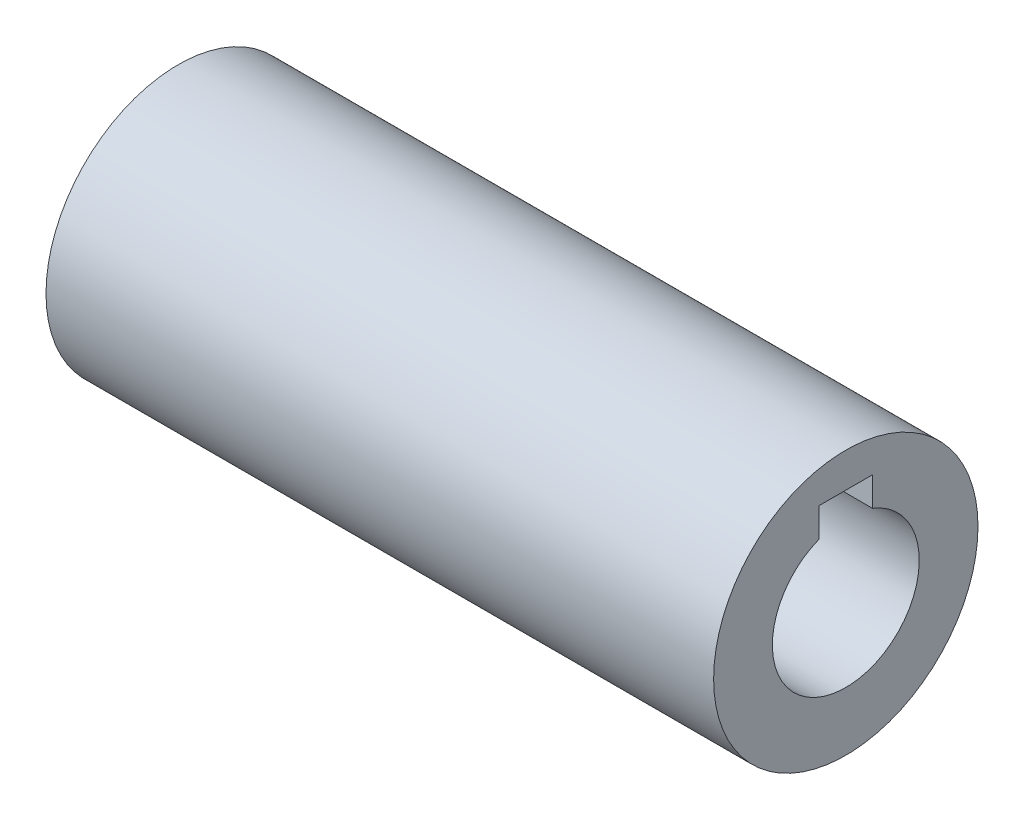
ISO-10303-21;
HEADER;
FILE_DESCRIPTION(('STEP AP214'),'2;1');
FILE_NAME('part.step','',(''),(''),'','','');
FILE_SCHEMA(('AUTOMOTIVE_DESIGN { 1 0 10303 214 1 1 1 1 }'));
ENDSEC;
DATA;
#1=APPLICATION_CONTEXT('core data for automotive mechanical design processes');
#2=APPLICATION_PROTOCOL_DEFINITION('international standard','automotive_design',2000,#1);
#3=PRODUCT_CONTEXT('',#1,'mechanical');
#4=PRODUCT('Part','Part','',(#3));
#5=PRODUCT_RELATED_PRODUCT_CATEGORY('part','',(#4));
#6=PRODUCT_DEFINITION_FORMATION('','',#4);
#7=PRODUCT_DEFINITION_CONTEXT('part definition',#1,'design');
#8=PRODUCT_DEFINITION('design','',#6,#7);
#9=PRODUCT_DEFINITION_SHAPE('','',#8);
#10=(LENGTH_UNIT() NAMED_UNIT(*) SI_UNIT(.MILLI.,.METRE.));
#11=(NAMED_UNIT(*) PLANE_ANGLE_UNIT() SI_UNIT($,.RADIAN.));
#12=(NAMED_UNIT(*) SI_UNIT($,.STERADIAN.) SOLID_ANGLE_UNIT());
#13=UNCERTAINTY_MEASURE_WITH_UNIT(LENGTH_MEASURE(1.E-05),#10,'distance_accuracy_value','');
#14=(GEOMETRIC_REPRESENTATION_CONTEXT(3) GLOBAL_UNCERTAINTY_ASSIGNED_CONTEXT((#13)) GLOBAL_UNIT_ASSIGNED_CONTEXT((#10,
#11,#12)) REPRESENTATION_CONTEXT('',''));
#15=CARTESIAN_POINT('',(0.,0.,0.));
#16=DIRECTION('',(0.,0.,1.));
#17=DIRECTION('',(1.,0.,0.));
#18=AXIS2_PLACEMENT_3D('',#15,#16,#17);
#19=CARTESIAN_POINT('',(-25.,-10.1705071808222,9.9));
#20=DIRECTION('',(-1.,0.,0.));
#21=DIRECTION('',(0.,1.,0.));
#22=AXIS2_PLACEMENT_3D('',#19,#20,#21);
#23=PLANE('',#22);
#24=CARTESIAN_POINT('',(-25.,0.,0.));
#25=DIRECTION('',(-1.,0.,0.));
#26=DIRECTION('',(0.,0.,-1.));
#27=AXIS2_PLACEMENT_3D('',#24,#25,#26);
#28=CIRCLE('',#27,9.9);
#29=CARTESIAN_POINT('',(-25.,0.,-9.9));
#30=VERTEX_POINT('',#29);
#31=EDGE_CURVE('E100',#30,#30,#28,.F.);
#32=ORIENTED_EDGE('',*,*,#31,.F.);
#33=EDGE_LOOP('',(#32));
#34=FACE_BOUND('',#33,.T.);
#35=DIRECTION('',(0.,-1.,0.));
#36=VECTOR('',#35,1.);
#37=CARTESIAN_POINT('',(-25.,7.3,2.));
#38=LINE('',#37,#36);
#39=CARTESIAN_POINT('',(-25.,5.1234753829798,2.));
#40=VERTEX_POINT('',#39);
#41=CARTESIAN_POINT('',(-25.,7.3,2.));
#42=VERTEX_POINT('',#41);
#43=EDGE_CURVE('E83',#40,#42,#38,.F.);
#44=ORIENTED_EDGE('',*,*,#43,.F.);
#45=CARTESIAN_POINT('',(-25.,0.,0.));
#46=DIRECTION('',(1.,0.,0.));
#47=DIRECTION('',(0.,-0.999999999999995,-1.02900297435445E-07));
#48=AXIS2_PLACEMENT_3D('',#45,#46,#47);
#49=CIRCLE('',#48,5.5);
#50=CARTESIAN_POINT('',(-25.,5.1234753829798,-2.));
#51=VERTEX_POINT('',#50);
#52=EDGE_CURVE('E97',#40,#51,#49,.T.);
#53=ORIENTED_EDGE('',*,*,#52,.T.);
#54=DIRECTION('',(0.,1.,0.));
#55=VECTOR('',#54,1.);
#56=CARTESIAN_POINT('',(-25.,5.1234753829798,-2.));
#57=LINE('',#56,#55);
#58=CARTESIAN_POINT('',(-25.,7.3,-2.));
#59=VERTEX_POINT('',#58);
#60=EDGE_CURVE('E105',#59,#51,#57,.F.);
#61=ORIENTED_EDGE('',*,*,#60,.F.);
#62=DIRECTION('',(0.,0.,1.));
#63=VECTOR('',#62,1.);
#64=CARTESIAN_POINT('',(-25.,7.3,-2.));
#65=LINE('',#64,#63);
#66=EDGE_CURVE('E99',#42,#59,#65,.F.);
#67=ORIENTED_EDGE('',*,*,#66,.F.);
#68=EDGE_LOOP('',(#44,#53,#61,#67));
#69=FACE_BOUND('',#68,.T.);
#70=ADVANCED_FACE('F16',(#34,#69),#23,.T.);
#71=CARTESIAN_POINT('',(25.,-10.1705071808222,-9.9));
#72=DIRECTION('',(1.,0.,0.));
#73=DIRECTION('',(0.,1.,0.));
#74=AXIS2_PLACEMENT_3D('',#71,#72,#73);
#75=PLANE('',#74);
#76=CARTESIAN_POINT('',(25.,0.,0.));
#77=DIRECTION('',(1.,0.,0.));
#78=DIRECTION('',(0.,0.,1.));
#79=AXIS2_PLACEMENT_3D('',#76,#77,#78);
#80=CIRCLE('',#79,9.9);
#81=CARTESIAN_POINT('',(25.,0.,9.9));
#82=VERTEX_POINT('',#81);
#83=EDGE_CURVE('E116',#82,#82,#80,.T.);
#84=ORIENTED_EDGE('',*,*,#83,.T.);
#85=EDGE_LOOP('',(#84));
#86=FACE_BOUND('',#85,.T.);
#87=DIRECTION('',(0.,0.,-1.));
#88=VECTOR('',#87,1.);
#89=CARTESIAN_POINT('',(25.,7.3,2.));
#90=LINE('',#89,#88);
#91=CARTESIAN_POINT('',(25.,7.3,-2.));
#92=VERTEX_POINT('',#91);
#93=CARTESIAN_POINT('',(25.,7.3,2.));
#94=VERTEX_POINT('',#93);
#95=EDGE_CURVE('E121',#92,#94,#90,.F.);
#96=ORIENTED_EDGE('',*,*,#95,.F.);
#97=DIRECTION('',(0.,-1.,0.));
#98=VECTOR('',#97,1.);
#99=CARTESIAN_POINT('',(25.,7.3,-2.));
#100=LINE('',#99,#98);
#101=CARTESIAN_POINT('',(25.,5.1234753829798,-2.));
#102=VERTEX_POINT('',#101);
#103=EDGE_CURVE('E124',#102,#92,#100,.F.);
#104=ORIENTED_EDGE('',*,*,#103,.F.);
#105=CARTESIAN_POINT('',(25.,0.,0.));
#106=DIRECTION('',(-1.,0.,0.));
#107=DIRECTION('',(0.,-0.999999999999995,1.0290029840432E-07));
#108=AXIS2_PLACEMENT_3D('',#105,#106,#107);
#109=CIRCLE('',#108,5.5);
#110=CARTESIAN_POINT('',(25.,5.1234753829798,2.));
#111=VERTEX_POINT('',#110);
#112=EDGE_CURVE('E128',#111,#102,#109,.F.);
#113=ORIENTED_EDGE('',*,*,#112,.F.);
#114=DIRECTION('',(0.,1.,0.));
#115=VECTOR('',#114,1.);
#116=CARTESIAN_POINT('',(25.,5.1234753829798,2.));
#117=LINE('',#116,#115);
#118=EDGE_CURVE('E91',#94,#111,#117,.F.);
#119=ORIENTED_EDGE('',*,*,#118,.F.);
#120=EDGE_LOOP('',(#96,#104,#113,#119));
#121=FACE_BOUND('',#120,.T.);
#122=ADVANCED_FACE('F204',(#86,#121),#75,.T.);
#123=CARTESIAN_POINT('',(25.,0.,0.));
#124=DIRECTION('',(1.,0.,0.));
#125=DIRECTION('',(0.,0.9315409787236,0.363636363636364));
#126=AXIS2_PLACEMENT_3D('',#123,#124,#125);
#127=CYLINDRICAL_SURFACE('',#126,5.5);
#128=DIRECTION('',(1.,0.,0.));
#129=VECTOR('',#128,1.);
#130=CARTESIAN_POINT('',(-25.,5.1234753829798,2.));
#131=LINE('',#130,#129);
#132=CARTESIAN_POINT('',(-9.,5.1234753829798,2.));
#133=VERTEX_POINT('',#132);
#134=EDGE_CURVE('E80',#40,#133,#131,.T.);
#135=ORIENTED_EDGE('',*,*,#134,.T.);
#136=CARTESIAN_POINT('',(-9.,0.,0.));
#137=DIRECTION('',(1.,0.,0.));
#138=DIRECTION('',(0.,0.9315409787236,0.363636363636364));
#139=AXIS2_PLACEMENT_3D('',#136,#137,#138);
#140=CIRCLE('',#139,5.5);
#141=CARTESIAN_POINT('',(-9.,5.1234753829798,-2.));
#142=VERTEX_POINT('',#141);
#143=EDGE_CURVE('E90',#133,#142,#140,.T.);
#144=ORIENTED_EDGE('',*,*,#143,.T.);
#145=DIRECTION('',(-1.,0.,0.));
#146=VECTOR('',#145,1.);
#147=CARTESIAN_POINT('',(-9.,5.1234753829798,-2.));
#148=LINE('',#147,#146);
#149=EDGE_CURVE('E104',#142,#51,#148,.T.);
#150=ORIENTED_EDGE('',*,*,#149,.T.);
#151=ORIENTED_EDGE('',*,*,#52,.F.);
#152=EDGE_LOOP('',(#135,#144,#150,#151));
#153=FACE_BOUND('',#152,.T.);
#154=ADVANCED_FACE('F103',(#153),#127,.F.);
#155=CARTESIAN_POINT('',(-9.,-5.75,5.91500720965625));
#156=DIRECTION('',(1.,0.,0.));
#157=DIRECTION('',(0.,0.,-1.));
#158=AXIS2_PLACEMENT_3D('',#155,#156,#157);
#159=PLANE('',#158);
#160=ORIENTED_EDGE('',*,*,#143,.F.);
#161=DIRECTION('',(0.,1.,0.));
#162=VECTOR('',#161,1.);
#163=CARTESIAN_POINT('',(-9.,5.1234753829798,2.));
#164=LINE('',#163,#162);
#165=CARTESIAN_POINT('',(-9.,5.39096466321196,2.));
#166=VERTEX_POINT('',#165);
#167=EDGE_CURVE('E85',#133,#166,#164,.T.);
#168=ORIENTED_EDGE('',*,*,#167,.T.);
#169=CARTESIAN_POINT('',(-9.,0.,0.));
#170=DIRECTION('',(1.,0.,0.));
#171=DIRECTION('',(0.,-1.,0.));
#172=AXIS2_PLACEMENT_3D('',#169,#170,#171);
#173=CIRCLE('',#172,5.75);
#174=CARTESIAN_POINT('',(-9.,5.39096466321196,-2.));
#175=VERTEX_POINT('',#174);
#176=EDGE_CURVE('E147',#166,#175,#173,.T.);
#177=ORIENTED_EDGE('',*,*,#176,.T.);
#178=DIRECTION('',(0.,-1.,0.));
#179=VECTOR('',#178,1.);
#180=CARTESIAN_POINT('',(-9.,5.39096466321196,-2.));
#181=LINE('',#180,#179);
#182=EDGE_CURVE('E152',#175,#142,#181,.T.);
#183=ORIENTED_EDGE('',*,*,#182,.T.);
#184=EDGE_LOOP('',(#160,#168,#177,#183));
#185=FACE_BOUND('',#184,.T.);
#186=ADVANCED_FACE('F215',(#185),#159,.T.);
#187=CARTESIAN_POINT('',(25.,0.,0.));
#188=DIRECTION('',(1.,0.,0.));
#189=DIRECTION('',(0.,0.937559071862949,0.347826086956521));
#190=AXIS2_PLACEMENT_3D('',#187,#188,#189);
#191=CYLINDRICAL_SURFACE('',#190,5.75);
#192=DIRECTION('',(1.,0.,0.));
#193=VECTOR('',#192,1.);
#194=CARTESIAN_POINT('',(-9.,5.39096466321196,2.));
#195=LINE('',#194,#193);
#196=CARTESIAN_POINT('',(9.,5.39096466321196,2.));
#197=VERTEX_POINT('',#196);
#198=EDGE_CURVE('E157',#166,#197,#195,.T.);
#199=ORIENTED_EDGE('',*,*,#198,.T.);
#200=CARTESIAN_POINT('',(9.,0.,0.));
#201=DIRECTION('',(1.,0.,0.));
#202=DIRECTION('',(0.,0.937559071862949,0.347826086956522));
#203=AXIS2_PLACEMENT_3D('',#200,#201,#202);
#204=CIRCLE('',#203,5.75);
#205=CARTESIAN_POINT('',(9.,5.39096466321196,-2.));
#206=VERTEX_POINT('',#205);
#207=EDGE_CURVE('E162',#197,#206,#204,.T.);
#208=ORIENTED_EDGE('',*,*,#207,.T.);
#209=DIRECTION('',(-1.,0.,0.));
#210=VECTOR('',#209,1.);
#211=CARTESIAN_POINT('',(9.,5.39096466321196,-2.));
#212=LINE('',#211,#210);
#213=EDGE_CURVE('E167',#206,#175,#212,.T.);
#214=ORIENTED_EDGE('',*,*,#213,.T.);
#215=ORIENTED_EDGE('',*,*,#176,.F.);
#216=EDGE_LOOP('',(#199,#208,#214,#215));
#217=FACE_BOUND('',#216,.T.);
#218=ADVANCED_FACE('F213',(#217),#191,.F.);
#219=CARTESIAN_POINT('',(9.,-5.75,-5.91500720965625));
#220=DIRECTION('',(-1.,0.,0.));
#221=DIRECTION('',(0.,0.,1.));
#222=AXIS2_PLACEMENT_3D('',#219,#220,#221);
#223=PLANE('',#222);
#224=ORIENTED_EDGE('',*,*,#207,.F.);
#225=DIRECTION('',(0.,-1.,0.));
#226=VECTOR('',#225,1.);
#227=CARTESIAN_POINT('',(9.,5.39096466321196,2.));
#228=LINE('',#227,#226);
#229=CARTESIAN_POINT('',(9.,5.1234753829798,2.));
#230=VERTEX_POINT('',#229);
#231=EDGE_CURVE('E172',#197,#230,#228,.T.);
#232=ORIENTED_EDGE('',*,*,#231,.T.);
#233=CARTESIAN_POINT('',(9.,0.,0.));
#234=DIRECTION('',(1.,0.,0.));
#235=DIRECTION('',(0.,-0.999999999999995,-1.02900297112486E-07));
#236=AXIS2_PLACEMENT_3D('',#233,#234,#235);
#237=CIRCLE('',#236,5.5);
#238=CARTESIAN_POINT('',(9.,5.1234753829798,-2.));
#239=VERTEX_POINT('',#238);
#240=EDGE_CURVE('E176',#230,#239,#237,.T.);
#241=ORIENTED_EDGE('',*,*,#240,.T.);
#242=DIRECTION('',(0.,1.,0.));
#243=VECTOR('',#242,1.);
#244=CARTESIAN_POINT('',(9.,5.1234753829798,-2.));
#245=LINE('',#244,#243);
#246=EDGE_CURVE('E32',#239,#206,#245,.T.);
#247=ORIENTED_EDGE('',*,*,#246,.T.);
#248=EDGE_LOOP('',(#224,#232,#241,#247));
#249=FACE_BOUND('',#248,.T.);
#250=ADVANCED_FACE('F210',(#249),#223,.T.);
#251=CARTESIAN_POINT('',(25.,0.,0.));
#252=DIRECTION('',(1.,0.,0.));
#253=DIRECTION('',(0.,0.9315409787236,0.363636363636364));
#254=AXIS2_PLACEMENT_3D('',#251,#252,#253);
#255=CYLINDRICAL_SURFACE('',#254,5.5);
#256=DIRECTION('',(1.,0.,0.));
#257=VECTOR('',#256,1.);
#258=CARTESIAN_POINT('',(9.,5.1234753829798,2.));
#259=LINE('',#258,#257);
#260=EDGE_CURVE('E40',#230,#111,#259,.T.);
#261=ORIENTED_EDGE('',*,*,#260,.T.);
#262=ORIENTED_EDGE('',*,*,#112,.T.);
#263=DIRECTION('',(-1.,0.,0.));
#264=VECTOR('',#263,1.);
#265=CARTESIAN_POINT('',(25.,5.1234753829798,-2.));
#266=LINE('',#265,#264);
#267=EDGE_CURVE('E187',#102,#239,#266,.T.);
#268=ORIENTED_EDGE('',*,*,#267,.T.);
#269=ORIENTED_EDGE('',*,*,#240,.F.);
#270=EDGE_LOOP('',(#261,#262,#268,#269));
#271=FACE_BOUND('',#270,.T.);
#272=ADVANCED_FACE('F206',(#271),#255,.F.);
#273=CARTESIAN_POINT('',(-25.,7.3,2.));
#274=DIRECTION('',(0.,-1.,0.));
#275=DIRECTION('',(0.,0.,-1.));
#276=AXIS2_PLACEMENT_3D('',#273,#274,#275);
#277=PLANE('',#276);
#278=ORIENTED_EDGE('',*,*,#66,.T.);
#279=DIRECTION('',(1.,0.,0.));
#280=VECTOR('',#279,1.);
#281=CARTESIAN_POINT('',(-25.,7.3,-2.));
#282=LINE('',#281,#280);
#283=EDGE_CURVE('E25',#92,#59,#282,.F.);
#284=ORIENTED_EDGE('',*,*,#283,.F.);
#285=ORIENTED_EDGE('',*,*,#95,.T.);
#286=DIRECTION('',(-1.,0.,0.));
#287=VECTOR('',#286,1.);
#288=CARTESIAN_POINT('',(25.,7.3,2.));
#289=LINE('',#288,#287);
#290=EDGE_CURVE('E11',#94,#42,#289,.T.);
#291=ORIENTED_EDGE('',*,*,#290,.T.);
#292=EDGE_LOOP('',(#278,#284,#285,#291));
#293=FACE_BOUND('',#292,.T.);
#294=ADVANCED_FACE('F200',(#293),#277,.T.);
#295=CARTESIAN_POINT('',(25.,5.1234753829798,2.));
#296=DIRECTION('',(0.,0.,-1.));
#297=DIRECTION('',(-1.,0.,0.));
#298=AXIS2_PLACEMENT_3D('',#295,#296,#297);
#299=PLANE('',#298);
#300=ORIENTED_EDGE('',*,*,#43,.T.);
#301=ORIENTED_EDGE('',*,*,#290,.F.);
#302=ORIENTED_EDGE('',*,*,#118,.T.);
#303=ORIENTED_EDGE('',*,*,#260,.F.);
#304=ORIENTED_EDGE('',*,*,#231,.F.);
#305=ORIENTED_EDGE('',*,*,#198,.F.);
#306=ORIENTED_EDGE('',*,*,#167,.F.);
#307=ORIENTED_EDGE('',*,*,#134,.F.);
#308=EDGE_LOOP('',(#300,#301,#302,#303,#304,#305,#306,#307));
#309=FACE_BOUND('',#308,.T.);
#310=ADVANCED_FACE('F82',(#309),#299,.T.);
#311=CARTESIAN_POINT('',(-25.,5.1234753829798,-2.));
#312=DIRECTION('',(0.,0.,1.));
#313=DIRECTION('',(1.,0.,0.));
#314=AXIS2_PLACEMENT_3D('',#311,#312,#313);
#315=PLANE('',#314);
#316=ORIENTED_EDGE('',*,*,#60,.T.);
#317=ORIENTED_EDGE('',*,*,#149,.F.);
#318=ORIENTED_EDGE('',*,*,#182,.F.);
#319=ORIENTED_EDGE('',*,*,#213,.F.);
#320=ORIENTED_EDGE('',*,*,#246,.F.);
#321=ORIENTED_EDGE('',*,*,#267,.F.);
#322=ORIENTED_EDGE('',*,*,#103,.T.);
#323=ORIENTED_EDGE('',*,*,#283,.T.);
#324=EDGE_LOOP('',(#316,#317,#318,#319,#320,#321,#322,#323));
#325=FACE_BOUND('',#324,.T.);
#326=ADVANCED_FACE('F196',(#325),#315,.T.);
#327=CARTESIAN_POINT('',(25.,0.,0.));
#328=DIRECTION('',(1.,0.,0.));
#329=DIRECTION('',(0.,0.,1.));
#330=AXIS2_PLACEMENT_3D('',#327,#328,#329);
#331=CYLINDRICAL_SURFACE('',#330,9.9);
#332=ORIENTED_EDGE('',*,*,#83,.F.);
#333=EDGE_LOOP('',(#332));
#334=FACE_BOUND('',#333,.T.);
#335=ORIENTED_EDGE('',*,*,#31,.T.);
#336=EDGE_LOOP('',(#335));
#337=FACE_BOUND('',#336,.T.);
#338=ADVANCED_FACE('F18',(#334,#337),#331,.T.);
#339=CLOSED_SHELL('',(#70,#122,#154,#186,#218,#250,#272,#294,#310,#326,#338));
#340=MANIFOLD_SOLID_BREP('B1',#339);
#341=ADVANCED_BREP_SHAPE_REPRESENTATION('',(#18,#340),#14);
#342=SHAPE_DEFINITION_REPRESENTATION(#9,#341);
ENDSEC;
END-ISO-10303-21;
